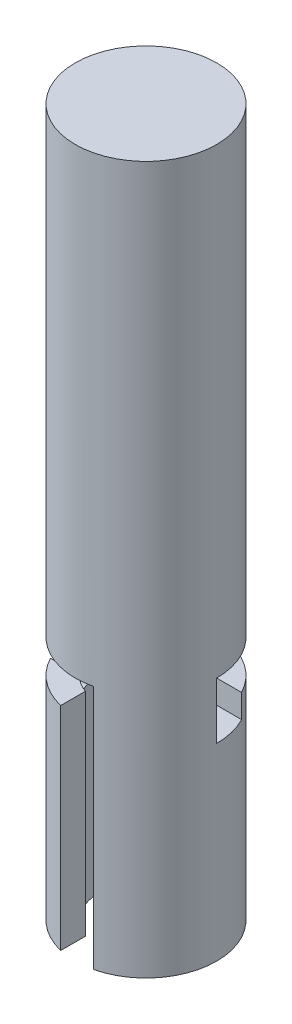
ISO-10303-21;
HEADER;
FILE_DESCRIPTION(('STEP AP214'),'2;1');
FILE_NAME('part.step','',(''),(''),'','','');
FILE_SCHEMA(('AUTOMOTIVE_DESIGN { 1 0 10303 214 1 1 1 1 }'));
ENDSEC;
DATA;
#1=APPLICATION_CONTEXT('core data for automotive mechanical design processes');
#2=APPLICATION_PROTOCOL_DEFINITION('international standard','automotive_design',2000,#1);
#3=PRODUCT_CONTEXT('',#1,'mechanical');
#4=PRODUCT('Part','Part','',(#3));
#5=PRODUCT_RELATED_PRODUCT_CATEGORY('part','',(#4));
#6=PRODUCT_DEFINITION_FORMATION('','',#4);
#7=PRODUCT_DEFINITION_CONTEXT('part definition',#1,'design');
#8=PRODUCT_DEFINITION('design','',#6,#7);
#9=PRODUCT_DEFINITION_SHAPE('','',#8);
#10=(LENGTH_UNIT() NAMED_UNIT(*) SI_UNIT(.MILLI.,.METRE.));
#11=(NAMED_UNIT(*) PLANE_ANGLE_UNIT() SI_UNIT($,.RADIAN.));
#12=(NAMED_UNIT(*) SI_UNIT($,.STERADIAN.) SOLID_ANGLE_UNIT());
#13=UNCERTAINTY_MEASURE_WITH_UNIT(LENGTH_MEASURE(1.E-05),#10,'distance_accuracy_value','');
#14=(GEOMETRIC_REPRESENTATION_CONTEXT(3) GLOBAL_UNCERTAINTY_ASSIGNED_CONTEXT((#13)) GLOBAL_UNIT_ASSIGNED_CONTEXT((#10,
#11,#12)) REPRESENTATION_CONTEXT('',''));
#15=CARTESIAN_POINT('',(0.,0.,0.));
#16=DIRECTION('',(0.,0.,1.));
#17=DIRECTION('',(1.,0.,0.));
#18=AXIS2_PLACEMENT_3D('',#15,#16,#17);
#19=CARTESIAN_POINT('',(0.,-23.,15.));
#20=DIRECTION('',(0.,-1.,0.));
#21=DIRECTION('',(0.,0.,-1.));
#22=AXIS2_PLACEMENT_3D('',#19,#20,#21);
#23=PLANE('',#22);
#24=CARTESIAN_POINT('',(0.,-23.,0.));
#25=DIRECTION('',(0.,-1.,0.));
#26=DIRECTION('',(0.,0.,-1.));
#27=AXIS2_PLACEMENT_3D('',#24,#25,#26);
#28=CIRCLE('',#27,15.);
#29=CARTESIAN_POINT('',(3.49999999999999,-23.,14.5859521458148));
#30=VERTEX_POINT('',#29);
#31=CARTESIAN_POINT('',(-15.,-23.,0.));
#32=VERTEX_POINT('',#31);
#33=EDGE_CURVE('E151',#30,#32,#28,.T.);
#34=ORIENTED_EDGE('',*,*,#33,.T.);
#35=DIRECTION('',(-1.,0.,0.));
#36=VECTOR('',#35,1.);
#37=CARTESIAN_POINT('',(0.,-23.,1.04744440165294E-13));
#38=LINE('',#37,#36);
#39=CARTESIAN_POINT('',(-10.,-23.,0.));
#40=VERTEX_POINT('',#39);
#41=EDGE_CURVE('E154',#40,#32,#38,.T.);
#42=ORIENTED_EDGE('',*,*,#41,.F.);
#43=CARTESIAN_POINT('',(0.,-23.,0.));
#44=DIRECTION('',(0.,-1.,0.));
#45=DIRECTION('',(0.,0.,-1.));
#46=AXIS2_PLACEMENT_3D('',#43,#44,#45);
#47=CIRCLE('',#46,10.);
#48=CARTESIAN_POINT('',(3.5,-23.,9.3674969975976));
#49=VERTEX_POINT('',#48);
#50=EDGE_CURVE('E212',#49,#40,#47,.T.);
#51=ORIENTED_EDGE('',*,*,#50,.F.);
#52=DIRECTION('',(0.,0.,1.));
#53=VECTOR('',#52,1.);
#54=CARTESIAN_POINT('',(3.49999999999999,-23.,15.));
#55=LINE('',#54,#53);
#56=EDGE_CURVE('E157',#49,#30,#55,.T.);
#57=ORIENTED_EDGE('',*,*,#56,.T.);
#58=EDGE_LOOP('',(#34,#42,#51,#57));
#59=FACE_BOUND('',#58,.T.);
#60=ADVANCED_FACE('F37',(#59),#23,.T.);
#61=CARTESIAN_POINT('',(3.49999999999999,-23.,15.));
#62=DIRECTION('',(1.,0.,0.));
#63=DIRECTION('',(0.,0.,-1.));
#64=AXIS2_PLACEMENT_3D('',#61,#62,#63);
#65=PLANE('',#64);
#66=ORIENTED_EDGE('',*,*,#56,.F.);
#67=DIRECTION('',(0.,-1.,0.));
#68=VECTOR('',#67,1.);
#69=CARTESIAN_POINT('',(3.5,-4.99999999999999,9.3674969975976));
#70=LINE('',#69,#68);
#71=CARTESIAN_POINT('',(3.5,-75.,9.3674969975976));
#72=VERTEX_POINT('',#71);
#73=EDGE_CURVE('E221',#49,#72,#70,.T.);
#74=ORIENTED_EDGE('',*,*,#73,.T.);
#75=DIRECTION('',(0.,0.,-1.));
#76=VECTOR('',#75,1.);
#77=CARTESIAN_POINT('',(3.5,-75.,0.));
#78=LINE('',#77,#76);
#79=CARTESIAN_POINT('',(3.49999999999999,-75.,14.5859521458148));
#80=VERTEX_POINT('',#79);
#81=EDGE_CURVE('E258',#80,#72,#78,.T.);
#82=ORIENTED_EDGE('',*,*,#81,.F.);
#83=DIRECTION('',(0.,-1.,0.));
#84=VECTOR('',#83,1.);
#85=CARTESIAN_POINT('',(3.5,75.,14.5859521458148));
#86=LINE('',#85,#84);
#87=EDGE_CURVE('E244',#30,#80,#86,.T.);
#88=ORIENTED_EDGE('',*,*,#87,.F.);
#89=EDGE_LOOP('',(#66,#74,#82,#88));
#90=FACE_BOUND('',#89,.T.);
#91=ADVANCED_FACE('F328',(#90),#65,.F.);
#92=CARTESIAN_POINT('',(-3.50000000000001,-23.,15.));
#93=DIRECTION('',(-1.,0.,0.));
#94=DIRECTION('',(0.,0.,1.));
#95=AXIS2_PLACEMENT_3D('',#92,#93,#94);
#96=PLANE('',#95);
#97=DIRECTION('',(0.,0.,-1.));
#98=VECTOR('',#97,1.);
#99=CARTESIAN_POINT('',(-3.50000000000001,-23.,15.));
#100=LINE('',#99,#98);
#101=CARTESIAN_POINT('',(-3.5,-23.,-9.3674969975976));
#102=VERTEX_POINT('',#101);
#103=CARTESIAN_POINT('',(-3.5,-23.,-14.5859521458148));
#104=VERTEX_POINT('',#103);
#105=EDGE_CURVE('E232',#102,#104,#100,.T.);
#106=ORIENTED_EDGE('',*,*,#105,.F.);
#107=DIRECTION('',(0.,-1.,0.));
#108=VECTOR('',#107,1.);
#109=CARTESIAN_POINT('',(-3.5,-4.99999999999999,-9.3674969975976));
#110=LINE('',#109,#108);
#111=CARTESIAN_POINT('',(-3.5,-75.,-9.3674969975976));
#112=VERTEX_POINT('',#111);
#113=EDGE_CURVE('E211',#102,#112,#110,.T.);
#114=ORIENTED_EDGE('',*,*,#113,.T.);
#115=DIRECTION('',(0.,0.,1.));
#116=VECTOR('',#115,1.);
#117=CARTESIAN_POINT('',(-3.5,-75.,0.));
#118=LINE('',#117,#116);
#119=CARTESIAN_POINT('',(-3.5,-75.,-14.5859521458148));
#120=VERTEX_POINT('',#119);
#121=EDGE_CURVE('E254',#120,#112,#118,.T.);
#122=ORIENTED_EDGE('',*,*,#121,.F.);
#123=DIRECTION('',(0.,-1.,0.));
#124=VECTOR('',#123,1.);
#125=CARTESIAN_POINT('',(-3.5,75.,-14.5859521458148));
#126=LINE('',#125,#124);
#127=EDGE_CURVE('E238',#104,#120,#126,.T.);
#128=ORIENTED_EDGE('',*,*,#127,.F.);
#129=EDGE_LOOP('',(#106,#114,#122,#128));
#130=FACE_BOUND('',#129,.T.);
#131=ADVANCED_FACE('F301',(#130),#96,.F.);
#132=CARTESIAN_POINT('',(0.,75.,0.));
#133=DIRECTION('',(0.,-1.,0.));
#134=DIRECTION('',(0.,0.,-1.));
#135=AXIS2_PLACEMENT_3D('',#132,#133,#134);
#136=CYLINDRICAL_SURFACE('',#135,15.);
#137=CARTESIAN_POINT('',(0.,75.,0.));
#138=DIRECTION('',(0.,1.,0.));
#139=DIRECTION('',(0.,0.,1.));
#140=AXIS2_PLACEMENT_3D('',#137,#138,#139);
#141=CIRCLE('',#140,15.);
#142=CARTESIAN_POINT('',(0.,75.,15.));
#143=VERTEX_POINT('',#142);
#144=EDGE_CURVE('E247',#143,#143,#141,.T.);
#145=ORIENTED_EDGE('',*,*,#144,.F.);
#146=EDGE_LOOP('',(#145));
#147=FACE_BOUND('',#146,.T.);
#148=DIRECTION('',(0.,-1.,0.));
#149=VECTOR('',#148,1.);
#150=CARTESIAN_POINT('',(-15.,-23.,0.));
#151=LINE('',#150,#149);
#152=CARTESIAN_POINT('',(-15.,-35.,-1.04744440165294E-13));
#153=VERTEX_POINT('',#152);
#154=EDGE_CURVE('E166',#32,#153,#151,.T.);
#155=ORIENTED_EDGE('',*,*,#154,.F.);
#156=ORIENTED_EDGE('',*,*,#33,.F.);
#157=ORIENTED_EDGE('',*,*,#87,.T.);
#158=CARTESIAN_POINT('',(0.,-75.,0.));
#159=DIRECTION('',(0.,1.,0.));
#160=DIRECTION('',(0.,0.,1.));
#161=AXIS2_PLACEMENT_3D('',#158,#159,#160);
#162=CIRCLE('',#161,15.);
#163=CARTESIAN_POINT('',(3.5,-75.,-14.5859521458148));
#164=VERTEX_POINT('',#163);
#165=EDGE_CURVE('E251',#80,#164,#162,.T.);
#166=ORIENTED_EDGE('',*,*,#165,.T.);
#167=DIRECTION('',(0.,-1.,0.));
#168=VECTOR('',#167,1.);
#169=CARTESIAN_POINT('',(3.5,75.,-14.5859521458148));
#170=LINE('',#169,#168);
#171=CARTESIAN_POINT('',(3.5,-30.,-14.5859521458148));
#172=VERTEX_POINT('',#171);
#173=EDGE_CURVE('E241',#164,#172,#170,.F.);
#174=ORIENTED_EDGE('',*,*,#173,.T.);
#175=CARTESIAN_POINT('',(0.,-30.,0.));
#176=DIRECTION('',(0.,1.,0.));
#177=DIRECTION('',(0.,0.,1.));
#178=AXIS2_PLACEMENT_3D('',#175,#176,#177);
#179=CIRCLE('',#178,15.);
#180=CARTESIAN_POINT('',(13.2664991614216,-30.,-7.));
#181=VERTEX_POINT('',#180);
#182=EDGE_CURVE('E230',#181,#172,#179,.T.);
#183=ORIENTED_EDGE('',*,*,#182,.F.);
#184=DIRECTION('',(0.,-1.,0.));
#185=VECTOR('',#184,1.);
#186=CARTESIAN_POINT('',(13.2664991614216,75.,-7.00000000000001));
#187=LINE('',#186,#185);
#188=CARTESIAN_POINT('',(13.2664991614216,-35.,-7.));
#189=VERTEX_POINT('',#188);
#190=EDGE_CURVE('E197',#181,#189,#187,.T.);
#191=ORIENTED_EDGE('',*,*,#190,.T.);
#192=CARTESIAN_POINT('',(0.,-35.,0.));
#193=DIRECTION('',(0.,-1.,0.));
#194=DIRECTION('',(0.,0.,-1.));
#195=AXIS2_PLACEMENT_3D('',#192,#193,#194);
#196=CIRCLE('',#195,15.);
#197=CARTESIAN_POINT('',(15.,-35.,0.));
#198=VERTEX_POINT('',#197);
#199=EDGE_CURVE('E189',#189,#198,#196,.T.);
#200=ORIENTED_EDGE('',*,*,#199,.T.);
#201=DIRECTION('',(0.,1.,0.));
#202=VECTOR('',#201,1.);
#203=CARTESIAN_POINT('',(15.,-30.,0.));
#204=LINE('',#203,#202);
#205=CARTESIAN_POINT('',(15.,-23.,0.));
#206=VERTEX_POINT('',#205);
#207=EDGE_CURVE('E224',#198,#206,#204,.T.);
#208=ORIENTED_EDGE('',*,*,#207,.T.);
#209=EDGE_CURVE('E163',#104,#206,#28,.T.);
#210=ORIENTED_EDGE('',*,*,#209,.F.);
#211=ORIENTED_EDGE('',*,*,#127,.T.);
#212=CARTESIAN_POINT('',(-3.50000000000001,-75.,14.5859521458148));
#213=VERTEX_POINT('',#212);
#214=EDGE_CURVE('E246',#120,#213,#162,.T.);
#215=ORIENTED_EDGE('',*,*,#214,.T.);
#216=DIRECTION('',(0.,-1.,0.));
#217=VECTOR('',#216,1.);
#218=CARTESIAN_POINT('',(-3.50000000000001,75.,14.5859521458148));
#219=LINE('',#218,#217);
#220=CARTESIAN_POINT('',(-3.50000000000001,-30.,14.5859521458148));
#221=VERTEX_POINT('',#220);
#222=EDGE_CURVE('E235',#213,#221,#219,.F.);
#223=ORIENTED_EDGE('',*,*,#222,.T.);
#224=CARTESIAN_POINT('',(0.,-30.,0.));
#225=DIRECTION('',(0.,-1.,0.));
#226=DIRECTION('',(0.,0.,-1.));
#227=AXIS2_PLACEMENT_3D('',#224,#225,#226);
#228=CIRCLE('',#227,15.);
#229=CARTESIAN_POINT('',(-13.2664991614216,-30.,6.99999999999995));
#230=VERTEX_POINT('',#229);
#231=EDGE_CURVE('E227',#221,#230,#228,.T.);
#232=ORIENTED_EDGE('',*,*,#231,.T.);
#233=DIRECTION('',(0.,-1.,0.));
#234=VECTOR('',#233,1.);
#235=CARTESIAN_POINT('',(-13.2664991614211,74.9999999999999,7.00000000000088));
#236=LINE('',#235,#234);
#237=CARTESIAN_POINT('',(-13.2664991614216,-35.0000000000001,6.99999999999991));
#238=VERTEX_POINT('',#237);
#239=EDGE_CURVE('E183',#230,#238,#236,.T.);
#240=ORIENTED_EDGE('',*,*,#239,.T.);
#241=CARTESIAN_POINT('',(0.,-35.,0.));
#242=DIRECTION('',(0.,-1.,0.));
#243=DIRECTION('',(0.,0.,-1.));
#244=AXIS2_PLACEMENT_3D('',#241,#242,#243);
#245=CIRCLE('',#244,15.);
#246=EDGE_CURVE('E172',#238,#153,#245,.T.);
#247=ORIENTED_EDGE('',*,*,#246,.T.);
#248=EDGE_LOOP('',(#155,#156,#157,#166,#174,#183,#191,#200,#208,#210,#211,#215,#223,#232,#240,#247));
#249=FACE_BOUND('',#248,.T.);
#250=ADVANCED_FACE('F39',(#147,#249),#136,.T.);
#251=CARTESIAN_POINT('',(0.,-75.,0.));
#252=DIRECTION('',(0.,1.,0.));
#253=DIRECTION('',(0.,0.,1.));
#254=AXIS2_PLACEMENT_3D('',#251,#252,#253);
#255=PLANE('',#254);
#256=ORIENTED_EDGE('',*,*,#81,.T.);
#257=CARTESIAN_POINT('',(0.,-75.,0.));
#258=DIRECTION('',(0.,-1.,0.));
#259=DIRECTION('',(0.,0.,-1.));
#260=AXIS2_PLACEMENT_3D('',#257,#258,#259);
#261=CIRCLE('',#260,10.);
#262=CARTESIAN_POINT('',(3.5,-75.,-9.3674969975976));
#263=VERTEX_POINT('',#262);
#264=EDGE_CURVE('E205',#263,#72,#261,.T.);
#265=ORIENTED_EDGE('',*,*,#264,.F.);
#266=EDGE_CURVE('E257',#263,#164,#78,.T.);
#267=ORIENTED_EDGE('',*,*,#266,.T.);
#268=ORIENTED_EDGE('',*,*,#165,.F.);
#269=EDGE_LOOP('',(#256,#265,#267,#268));
#270=FACE_BOUND('',#269,.T.);
#271=ADVANCED_FACE('F325',(#270),#255,.F.);
#272=CARTESIAN_POINT('',(0.,75.,0.));
#273=DIRECTION('',(0.,1.,0.));
#274=DIRECTION('',(0.,0.,1.));
#275=AXIS2_PLACEMENT_3D('',#272,#273,#274);
#276=PLANE('',#275);
#277=ORIENTED_EDGE('',*,*,#144,.T.);
#278=EDGE_LOOP('',(#277));
#279=FACE_BOUND('',#278,.T.);
#280=ADVANCED_FACE('F345',(#279),#276,.T.);
#281=ORIENTED_EDGE('',*,*,#121,.T.);
#282=CARTESIAN_POINT('',(-3.5,-75.,9.36749699759759));
#283=VERTEX_POINT('',#282);
#284=EDGE_CURVE('E200',#283,#112,#261,.T.);
#285=ORIENTED_EDGE('',*,*,#284,.F.);
#286=EDGE_CURVE('E250',#283,#213,#118,.T.);
#287=ORIENTED_EDGE('',*,*,#286,.T.);
#288=ORIENTED_EDGE('',*,*,#214,.F.);
#289=EDGE_LOOP('',(#281,#285,#287,#288));
#290=FACE_BOUND('',#289,.T.);
#291=ADVANCED_FACE('F297',(#290),#255,.F.);
#292=ORIENTED_EDGE('',*,*,#209,.T.);
#293=DIRECTION('',(1.,0.,0.));
#294=VECTOR('',#293,1.);
#295=CARTESIAN_POINT('',(0.,-23.,0.));
#296=LINE('',#295,#294);
#297=CARTESIAN_POINT('',(10.,-23.,0.));
#298=VERTEX_POINT('',#297);
#299=EDGE_CURVE('E185',#298,#206,#296,.T.);
#300=ORIENTED_EDGE('',*,*,#299,.F.);
#301=EDGE_CURVE('E209',#102,#298,#47,.T.);
#302=ORIENTED_EDGE('',*,*,#301,.F.);
#303=ORIENTED_EDGE('',*,*,#105,.T.);
#304=EDGE_LOOP('',(#292,#300,#302,#303));
#305=FACE_BOUND('',#304,.T.);
#306=ADVANCED_FACE('F305',(#305),#23,.T.);
#307=ORIENTED_EDGE('',*,*,#266,.F.);
#308=DIRECTION('',(0.,-1.,0.));
#309=VECTOR('',#308,1.);
#310=CARTESIAN_POINT('',(3.5,-4.99999999999999,-9.3674969975976));
#311=LINE('',#310,#309);
#312=CARTESIAN_POINT('',(3.5,-30.,-9.3674969975976));
#313=VERTEX_POINT('',#312);
#314=EDGE_CURVE('E204',#263,#313,#311,.F.);
#315=ORIENTED_EDGE('',*,*,#314,.T.);
#316=DIRECTION('',(0.,0.,1.));
#317=VECTOR('',#316,1.);
#318=CARTESIAN_POINT('',(3.49999999999999,-30.,15.));
#319=LINE('',#318,#317);
#320=EDGE_CURVE('E262',#172,#313,#319,.T.);
#321=ORIENTED_EDGE('',*,*,#320,.F.);
#322=ORIENTED_EDGE('',*,*,#173,.F.);
#323=EDGE_LOOP('',(#307,#315,#321,#322));
#324=FACE_BOUND('',#323,.T.);
#325=ADVANCED_FACE('F322',(#324),#65,.F.);
#326=ORIENTED_EDGE('',*,*,#286,.F.);
#327=DIRECTION('',(0.,-1.,0.));
#328=VECTOR('',#327,1.);
#329=CARTESIAN_POINT('',(-3.5,-4.99999999999999,9.36749699759759));
#330=LINE('',#329,#328);
#331=CARTESIAN_POINT('',(-3.5,-30.,9.36749699759759));
#332=VERTEX_POINT('',#331);
#333=EDGE_CURVE('E218',#283,#332,#330,.F.);
#334=ORIENTED_EDGE('',*,*,#333,.T.);
#335=DIRECTION('',(0.,0.,1.));
#336=VECTOR('',#335,1.);
#337=CARTESIAN_POINT('',(-3.50000000000001,-30.,15.));
#338=LINE('',#337,#336);
#339=EDGE_CURVE('E162',#332,#221,#338,.T.);
#340=ORIENTED_EDGE('',*,*,#339,.T.);
#341=ORIENTED_EDGE('',*,*,#222,.F.);
#342=EDGE_LOOP('',(#326,#334,#340,#341));
#343=FACE_BOUND('',#342,.T.);
#344=ADVANCED_FACE('F294',(#343),#96,.F.);
#345=CARTESIAN_POINT('',(0.,-30.,0.));
#346=DIRECTION('',(0.,-1.,0.));
#347=DIRECTION('',(0.,0.,-1.));
#348=AXIS2_PLACEMENT_3D('',#345,#346,#347);
#349=PLANE('',#348);
#350=CARTESIAN_POINT('',(0.,-30.,0.));
#351=DIRECTION('',(0.,-1.,0.));
#352=DIRECTION('',(0.,0.,-1.));
#353=AXIS2_PLACEMENT_3D('',#350,#351,#352);
#354=CIRCLE('',#353,10.);
#355=CARTESIAN_POINT('',(-7.14142842854264,-30.,7.00000000000021));
#356=VERTEX_POINT('',#355);
#357=EDGE_CURVE('E215',#332,#356,#354,.T.);
#358=ORIENTED_EDGE('',*,*,#357,.T.);
#359=DIRECTION('',(-1.,0.,0.));
#360=VECTOR('',#359,1.);
#361=CARTESIAN_POINT('',(0.,-30.,7.00000000000004));
#362=LINE('',#361,#360);
#363=EDGE_CURVE('E180',#356,#230,#362,.T.);
#364=ORIENTED_EDGE('',*,*,#363,.T.);
#365=ORIENTED_EDGE('',*,*,#231,.F.);
#366=ORIENTED_EDGE('',*,*,#339,.F.);
#367=EDGE_LOOP('',(#358,#364,#365,#366));
#368=FACE_BOUND('',#367,.T.);
#369=ADVANCED_FACE('F290',(#368),#349,.F.);
#370=CARTESIAN_POINT('',(0.,-30.,0.));
#371=DIRECTION('',(0.,1.,0.));
#372=DIRECTION('',(0.,0.,1.));
#373=AXIS2_PLACEMENT_3D('',#370,#371,#372);
#374=PLANE('',#373);
#375=DIRECTION('',(-1.,0.,0.));
#376=VECTOR('',#375,1.);
#377=CARTESIAN_POINT('',(0.,-30.,-7.));
#378=LINE('',#377,#376);
#379=CARTESIAN_POINT('',(7.14142842854285,-30.,-7.));
#380=VERTEX_POINT('',#379);
#381=EDGE_CURVE('E195',#181,#380,#378,.T.);
#382=ORIENTED_EDGE('',*,*,#381,.F.);
#383=ORIENTED_EDGE('',*,*,#182,.T.);
#384=ORIENTED_EDGE('',*,*,#320,.T.);
#385=CARTESIAN_POINT('',(0.,-30.,0.));
#386=DIRECTION('',(0.,1.,0.));
#387=DIRECTION('',(0.,0.,1.));
#388=AXIS2_PLACEMENT_3D('',#385,#386,#387);
#389=CIRCLE('',#388,10.);
#390=EDGE_CURVE('E265',#380,#313,#389,.T.);
#391=ORIENTED_EDGE('',*,*,#390,.F.);
#392=EDGE_LOOP('',(#382,#383,#384,#391));
#393=FACE_BOUND('',#392,.T.);
#394=ADVANCED_FACE('F317',(#393),#374,.T.);
#395=CARTESIAN_POINT('',(0.,-4.99999999999999,0.));
#396=DIRECTION('',(0.,-1.,0.));
#397=DIRECTION('',(0.,0.,-1.));
#398=AXIS2_PLACEMENT_3D('',#395,#396,#397);
#399=CYLINDRICAL_SURFACE('',#398,10.);
#400=ORIENTED_EDGE('',*,*,#50,.T.);
#401=DIRECTION('',(0.,-1.,0.));
#402=VECTOR('',#401,1.);
#403=CARTESIAN_POINT('',(-10.,-4.99999999999999,1.92031473636372E-13));
#404=LINE('',#403,#402);
#405=CARTESIAN_POINT('',(-10.,-35.,1.92031473636372E-13));
#406=VERTEX_POINT('',#405);
#407=EDGE_CURVE('E169',#40,#406,#404,.T.);
#408=ORIENTED_EDGE('',*,*,#407,.T.);
#409=CARTESIAN_POINT('',(0.,-35.,0.));
#410=DIRECTION('',(0.,-1.,0.));
#411=DIRECTION('',(0.,0.,-1.));
#412=AXIS2_PLACEMENT_3D('',#409,#410,#411);
#413=CIRCLE('',#412,10.);
#414=CARTESIAN_POINT('',(-7.1414284285429,-35.0000000000001,6.99999999999995));
#415=VERTEX_POINT('',#414);
#416=EDGE_CURVE('E45',#406,#415,#413,.F.);
#417=ORIENTED_EDGE('',*,*,#416,.T.);
#418=DIRECTION('',(0.,-1.,0.));
#419=VECTOR('',#418,1.);
#420=CARTESIAN_POINT('',(-7.14142842854264,-5.00000000000005,7.00000000000021));
#421=LINE('',#420,#419);
#422=EDGE_CURVE('E11',#415,#356,#421,.F.);
#423=ORIENTED_EDGE('',*,*,#422,.T.);
#424=ORIENTED_EDGE('',*,*,#357,.F.);
#425=ORIENTED_EDGE('',*,*,#333,.F.);
#426=ORIENTED_EDGE('',*,*,#284,.T.);
#427=ORIENTED_EDGE('',*,*,#113,.F.);
#428=ORIENTED_EDGE('',*,*,#301,.T.);
#429=DIRECTION('',(0.,-1.,0.));
#430=VECTOR('',#429,1.);
#431=CARTESIAN_POINT('',(10.,-4.99999999999999,0.));
#432=LINE('',#431,#430);
#433=CARTESIAN_POINT('',(10.,-35.,0.));
#434=VERTEX_POINT('',#433);
#435=EDGE_CURVE('E267',#298,#434,#432,.T.);
#436=ORIENTED_EDGE('',*,*,#435,.T.);
#437=CARTESIAN_POINT('',(0.,-35.,0.));
#438=DIRECTION('',(0.,-1.,0.));
#439=DIRECTION('',(0.,0.,-1.));
#440=AXIS2_PLACEMENT_3D('',#437,#438,#439);
#441=CIRCLE('',#440,10.);
#442=CARTESIAN_POINT('',(7.14142842854285,-35.,-7.));
#443=VERTEX_POINT('',#442);
#444=EDGE_CURVE('E270',#434,#443,#441,.F.);
#445=ORIENTED_EDGE('',*,*,#444,.T.);
#446=DIRECTION('',(0.,-1.,0.));
#447=VECTOR('',#446,1.);
#448=CARTESIAN_POINT('',(7.14142842854285,-4.99999999999999,-7.));
#449=LINE('',#448,#447);
#450=EDGE_CURVE('E273',#443,#380,#449,.F.);
#451=ORIENTED_EDGE('',*,*,#450,.T.);
#452=ORIENTED_EDGE('',*,*,#390,.T.);
#453=ORIENTED_EDGE('',*,*,#314,.F.);
#454=ORIENTED_EDGE('',*,*,#264,.T.);
#455=ORIENTED_EDGE('',*,*,#73,.F.);
#456=EDGE_LOOP('',(#400,#408,#417,#423,#424,#425,#426,#427,#428,#436,#445,#451,#452,#453,#454,#455));
#457=FACE_BOUND('',#456,.T.);
#458=CARTESIAN_POINT('',(0.,-4.99999999999999,0.));
#459=DIRECTION('',(0.,-1.,0.));
#460=DIRECTION('',(0.,0.,-1.));
#461=AXIS2_PLACEMENT_3D('',#458,#459,#460);
#462=CIRCLE('',#461,10.);
#463=CARTESIAN_POINT('',(0.,-4.99999999999999,-10.));
#464=VERTEX_POINT('',#463);
#465=EDGE_CURVE('E201',#464,#464,#462,.T.);
#466=ORIENTED_EDGE('',*,*,#465,.F.);
#467=EDGE_LOOP('',(#466));
#468=FACE_BOUND('',#467,.T.);
#469=ADVANCED_FACE('F278',(#457,#468),#399,.F.);
#470=CARTESIAN_POINT('',(0.,-4.99999999999999,0.));
#471=DIRECTION('',(0.,-1.,0.));
#472=DIRECTION('',(0.,0.,-1.));
#473=AXIS2_PLACEMENT_3D('',#470,#471,#472);
#474=PLANE('',#473);
#475=ORIENTED_EDGE('',*,*,#465,.T.);
#476=EDGE_LOOP('',(#475));
#477=FACE_BOUND('',#476,.T.);
#478=ADVANCED_FACE('F353',(#477),#474,.T.);
#479=CARTESIAN_POINT('',(0.,-23.,-7.));
#480=DIRECTION('',(0.,0.,-1.));
#481=DIRECTION('',(0.,1.,0.));
#482=AXIS2_PLACEMENT_3D('',#479,#480,#481);
#483=PLANE('',#482);
#484=ORIENTED_EDGE('',*,*,#381,.T.);
#485=ORIENTED_EDGE('',*,*,#450,.F.);
#486=DIRECTION('',(1.,0.,0.));
#487=VECTOR('',#486,1.);
#488=CARTESIAN_POINT('',(0.,-35.,-7.));
#489=LINE('',#488,#487);
#490=EDGE_CURVE('E186',#443,#189,#489,.T.);
#491=ORIENTED_EDGE('',*,*,#490,.T.);
#492=ORIENTED_EDGE('',*,*,#190,.F.);
#493=EDGE_LOOP('',(#484,#485,#491,#492));
#494=FACE_BOUND('',#493,.T.);
#495=ADVANCED_FACE('F313',(#494),#483,.F.);
#496=CARTESIAN_POINT('',(0.,-35.,0.));
#497=DIRECTION('',(0.,-1.,0.));
#498=DIRECTION('',(0.,0.,-1.));
#499=AXIS2_PLACEMENT_3D('',#496,#497,#498);
#500=PLANE('',#499);
#501=ORIENTED_EDGE('',*,*,#490,.F.);
#502=ORIENTED_EDGE('',*,*,#444,.F.);
#503=DIRECTION('',(1.,0.,0.));
#504=VECTOR('',#503,1.);
#505=CARTESIAN_POINT('',(0.,-35.,0.));
#506=LINE('',#505,#504);
#507=EDGE_CURVE('E60',#434,#198,#506,.T.);
#508=ORIENTED_EDGE('',*,*,#507,.T.);
#509=ORIENTED_EDGE('',*,*,#199,.F.);
#510=EDGE_LOOP('',(#501,#502,#508,#509));
#511=FACE_BOUND('',#510,.T.);
#512=ADVANCED_FACE('F311',(#511),#500,.F.);
#513=CARTESIAN_POINT('',(0.,-23.,0.));
#514=DIRECTION('',(0.,0.,1.));
#515=DIRECTION('',(1.,0.,0.));
#516=AXIS2_PLACEMENT_3D('',#513,#514,#515);
#517=PLANE('',#516);
#518=ORIENTED_EDGE('',*,*,#299,.T.);
#519=ORIENTED_EDGE('',*,*,#207,.F.);
#520=ORIENTED_EDGE('',*,*,#507,.F.);
#521=ORIENTED_EDGE('',*,*,#435,.F.);
#522=EDGE_LOOP('',(#518,#519,#520,#521));
#523=FACE_BOUND('',#522,.T.);
#524=ADVANCED_FACE('F307',(#523),#517,.F.);
#525=CARTESIAN_POINT('',(0.,-23.0000000000001,7.00000000000011));
#526=DIRECTION('',(0.,0.,1.));
#527=DIRECTION('',(0.,-1.,0.));
#528=AXIS2_PLACEMENT_3D('',#525,#526,#527);
#529=PLANE('',#528);
#530=ORIENTED_EDGE('',*,*,#363,.F.);
#531=ORIENTED_EDGE('',*,*,#422,.F.);
#532=DIRECTION('',(-1.,0.,0.));
#533=VECTOR('',#532,1.);
#534=CARTESIAN_POINT('',(0.,-35.0000000000001,7.));
#535=LINE('',#534,#533);
#536=EDGE_CURVE('E175',#415,#238,#535,.T.);
#537=ORIENTED_EDGE('',*,*,#536,.T.);
#538=ORIENTED_EDGE('',*,*,#239,.F.);
#539=EDGE_LOOP('',(#530,#531,#537,#538));
#540=FACE_BOUND('',#539,.T.);
#541=ADVANCED_FACE('F284',(#540),#529,.F.);
#542=CARTESIAN_POINT('',(0.,-35.,0.));
#543=DIRECTION('',(0.,-1.,0.));
#544=DIRECTION('',(0.,0.,-1.));
#545=AXIS2_PLACEMENT_3D('',#542,#543,#544);
#546=PLANE('',#545);
#547=ORIENTED_EDGE('',*,*,#536,.F.);
#548=ORIENTED_EDGE('',*,*,#416,.F.);
#549=DIRECTION('',(-1.,0.,0.));
#550=VECTOR('',#549,1.);
#551=CARTESIAN_POINT('',(0.,-35.,0.));
#552=LINE('',#551,#550);
#553=EDGE_CURVE('E52',#406,#153,#552,.T.);
#554=ORIENTED_EDGE('',*,*,#553,.T.);
#555=ORIENTED_EDGE('',*,*,#246,.F.);
#556=EDGE_LOOP('',(#547,#548,#554,#555));
#557=FACE_BOUND('',#556,.T.);
#558=ADVANCED_FACE('F282',(#557),#546,.F.);
#559=CARTESIAN_POINT('',(0.,-23.,1.04744440165294E-13));
#560=DIRECTION('',(0.,0.,-1.));
#561=DIRECTION('',(0.,1.,0.));
#562=AXIS2_PLACEMENT_3D('',#559,#560,#561);
#563=PLANE('',#562);
#564=ORIENTED_EDGE('',*,*,#407,.F.);
#565=ORIENTED_EDGE('',*,*,#41,.T.);
#566=ORIENTED_EDGE('',*,*,#154,.T.);
#567=ORIENTED_EDGE('',*,*,#553,.F.);
#568=EDGE_LOOP('',(#564,#565,#566,#567));
#569=FACE_BOUND('',#568,.T.);
#570=ADVANCED_FACE('F165',(#569),#563,.F.);
#571=CLOSED_SHELL('',(#60,#91,#131,#250,#271,#280,#291,#306,#325,#344,#369,#394,#469,#478,#495,
#512,#524,#541,#558,#570));
#572=MANIFOLD_SOLID_BREP('B2',#571);
#573=ADVANCED_BREP_SHAPE_REPRESENTATION('',(#18,#572),#14);
#574=SHAPE_DEFINITION_REPRESENTATION(#9,#573);
ENDSEC;
END-ISO-10303-21;
